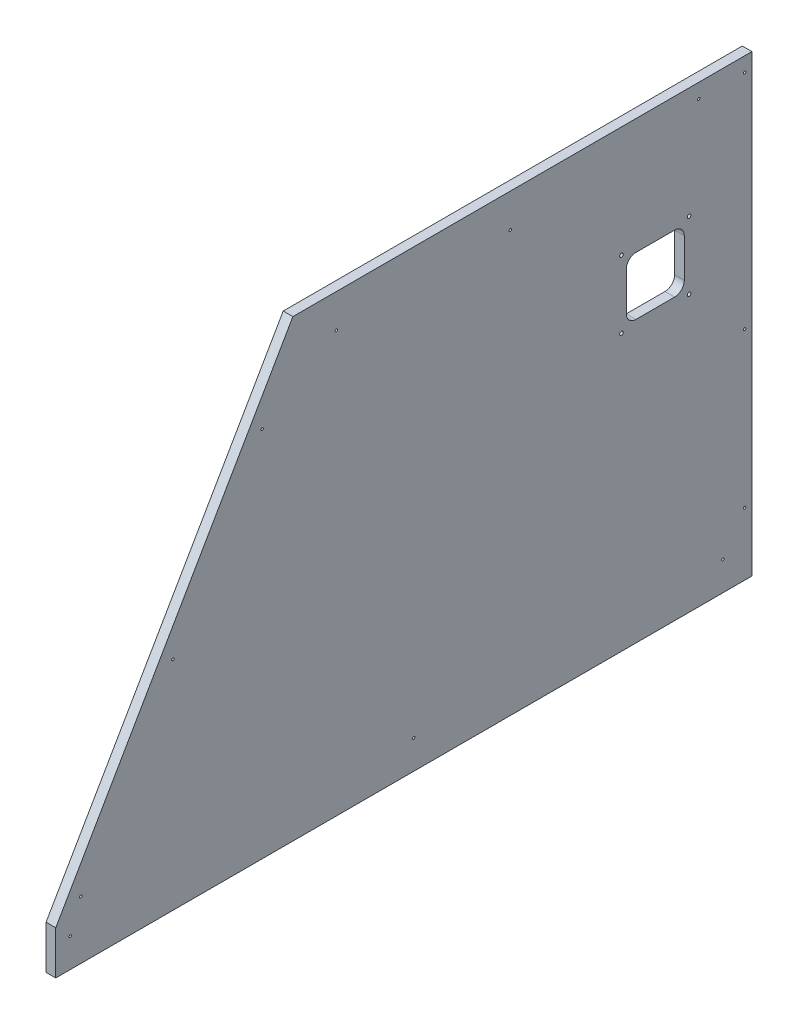
ISO-10303-21;
HEADER;
FILE_DESCRIPTION(('STEP AP214'),'2;1');
FILE_NAME('part.step','',(''),(''),'','','');
FILE_SCHEMA(('AUTOMOTIVE_DESIGN { 1 0 10303 214 1 1 1 1 }'));
ENDSEC;
DATA;
#1=APPLICATION_CONTEXT('core data for automotive mechanical design processes');
#2=APPLICATION_PROTOCOL_DEFINITION('international standard','automotive_design',2000,#1);
#3=PRODUCT_CONTEXT('',#1,'mechanical');
#4=PRODUCT('Part','Part','',(#3));
#5=PRODUCT_RELATED_PRODUCT_CATEGORY('part','',(#4));
#6=PRODUCT_DEFINITION_FORMATION('','',#4);
#7=PRODUCT_DEFINITION_CONTEXT('part definition',#1,'design');
#8=PRODUCT_DEFINITION('design','',#6,#7);
#9=PRODUCT_DEFINITION_SHAPE('','',#8);
#10=(LENGTH_UNIT() NAMED_UNIT(*) SI_UNIT(.MILLI.,.METRE.));
#11=(NAMED_UNIT(*) PLANE_ANGLE_UNIT() SI_UNIT($,.RADIAN.));
#12=(NAMED_UNIT(*) SI_UNIT($,.STERADIAN.) SOLID_ANGLE_UNIT());
#13=UNCERTAINTY_MEASURE_WITH_UNIT(LENGTH_MEASURE(1.E-05),#10,'distance_accuracy_value','');
#14=(GEOMETRIC_REPRESENTATION_CONTEXT(3) GLOBAL_UNCERTAINTY_ASSIGNED_CONTEXT((#13)) GLOBAL_UNIT_ASSIGNED_CONTEXT((#10,
#11,#12)) REPRESENTATION_CONTEXT('',''));
#15=CARTESIAN_POINT('',(0.,0.,0.));
#16=DIRECTION('',(0.,0.,1.));
#17=DIRECTION('',(1.,0.,0.));
#18=AXIS2_PLACEMENT_3D('',#15,#16,#17);
#19=CARTESIAN_POINT('',(-622.3,0.,0.));
#20=DIRECTION('',(-1.,0.,0.));
#21=DIRECTION('',(0.,0.,1.));
#22=AXIS2_PLACEMENT_3D('',#19,#20,#21);
#23=PLANE('',#22);
#24=DIRECTION('',(0.,0.,-1.));
#25=VECTOR('',#24,1.);
#26=CARTESIAN_POINT('',(-622.3,368.3,-501.65));
#27=LINE('',#26,#25);
#28=CARTESIAN_POINT('',(-622.3,368.3,-450.85));
#29=VERTEX_POINT('',#28);
#30=CARTESIAN_POINT('',(-622.3,368.3,-501.65));
#31=VERTEX_POINT('',#30);
#32=EDGE_CURVE('E138',#29,#31,#27,.T.);
#33=ORIENTED_EDGE('',*,*,#32,.T.);
#34=CARTESIAN_POINT('',(-622.3,381.,-501.65));
#35=DIRECTION('',(-1.,0.,0.));
#36=DIRECTION('',(0.,0.,1.));
#37=AXIS2_PLACEMENT_3D('',#34,#35,#36);
#38=CIRCLE('',#37,12.7);
#39=CARTESIAN_POINT('',(-622.3,381.,-514.35));
#40=VERTEX_POINT('',#39);
#41=EDGE_CURVE('E82',#31,#40,#38,.F.);
#42=ORIENTED_EDGE('',*,*,#41,.T.);
#43=DIRECTION('',(0.,1.,0.));
#44=VECTOR('',#43,1.);
#45=CARTESIAN_POINT('',(-622.3,431.8,-514.35));
#46=LINE('',#45,#44);
#47=CARTESIAN_POINT('',(-622.3,431.8,-514.35));
#48=VERTEX_POINT('',#47);
#49=EDGE_CURVE('E150',#40,#48,#46,.T.);
#50=ORIENTED_EDGE('',*,*,#49,.T.);
#51=CARTESIAN_POINT('',(-622.3,431.8,-501.65));
#52=DIRECTION('',(-1.,0.,0.));
#53=DIRECTION('',(0.,0.,1.));
#54=AXIS2_PLACEMENT_3D('',#51,#52,#53);
#55=CIRCLE('',#54,12.7);
#56=CARTESIAN_POINT('',(-622.3,444.5,-501.65));
#57=VERTEX_POINT('',#56);
#58=EDGE_CURVE('E221',#48,#57,#55,.F.);
#59=ORIENTED_EDGE('',*,*,#58,.T.);
#60=DIRECTION('',(0.,0.,1.));
#61=VECTOR('',#60,1.);
#62=CARTESIAN_POINT('',(-622.3,444.5,-450.85));
#63=LINE('',#62,#61);
#64=CARTESIAN_POINT('',(-622.3,444.5,-450.85));
#65=VERTEX_POINT('',#64);
#66=EDGE_CURVE('E146',#57,#65,#63,.T.);
#67=ORIENTED_EDGE('',*,*,#66,.T.);
#68=CARTESIAN_POINT('',(-622.3,431.8,-450.85));
#69=DIRECTION('',(-1.,0.,0.));
#70=DIRECTION('',(0.,0.,1.));
#71=AXIS2_PLACEMENT_3D('',#68,#69,#70);
#72=CIRCLE('',#71,12.7);
#73=CARTESIAN_POINT('',(-622.3,431.8,-438.15));
#74=VERTEX_POINT('',#73);
#75=EDGE_CURVE('E219',#65,#74,#72,.F.);
#76=ORIENTED_EDGE('',*,*,#75,.T.);
#77=DIRECTION('',(0.,1.,0.));
#78=VECTOR('',#77,1.);
#79=CARTESIAN_POINT('',(-622.3,381.,-438.15));
#80=LINE('',#79,#78);
#81=CARTESIAN_POINT('',(-622.3,381.,-438.15));
#82=VERTEX_POINT('',#81);
#83=EDGE_CURVE('E142',#74,#82,#80,.F.);
#84=ORIENTED_EDGE('',*,*,#83,.T.);
#85=CARTESIAN_POINT('',(-622.3,381.,-450.85));
#86=DIRECTION('',(-1.,0.,0.));
#87=DIRECTION('',(0.,0.,1.));
#88=AXIS2_PLACEMENT_3D('',#85,#86,#87);
#89=CIRCLE('',#88,12.7);
#90=EDGE_CURVE('E217',#82,#29,#89,.F.);
#91=ORIENTED_EDGE('',*,*,#90,.T.);
#92=EDGE_LOOP('',(#33,#42,#50,#59,#67,#76,#84,#91));
#93=FACE_BOUND('',#92,.T.);
#94=CARTESIAN_POINT('',(-622.3,450.85,-431.8));
#95=DIRECTION('',(-1.,0.,0.));
#96=DIRECTION('',(0.,0.,1.));
#97=AXIS2_PLACEMENT_3D('',#94,#95,#96);
#98=CIRCLE('',#97,2.38125);
#99=CARTESIAN_POINT('',(-622.3,450.85,-429.41875));
#100=VERTEX_POINT('',#99);
#101=EDGE_CURVE('E224',#100,#100,#98,.F.);
#102=ORIENTED_EDGE('',*,*,#101,.T.);
#103=EDGE_LOOP('',(#102));
#104=FACE_BOUND('',#103,.T.);
#105=CARTESIAN_POINT('',(-622.3,361.95,-431.8));
#106=DIRECTION('',(-1.,0.,0.));
#107=DIRECTION('',(0.,0.,1.));
#108=AXIS2_PLACEMENT_3D('',#105,#106,#107);
#109=CIRCLE('',#108,2.38125);
#110=CARTESIAN_POINT('',(-622.3,361.95,-429.41875));
#111=VERTEX_POINT('',#110);
#112=EDGE_CURVE('E227',#111,#111,#109,.F.);
#113=ORIENTED_EDGE('',*,*,#112,.T.);
#114=EDGE_LOOP('',(#113));
#115=FACE_BOUND('',#114,.T.);
#116=CARTESIAN_POINT('',(-622.3,361.95,-520.7));
#117=DIRECTION('',(-1.,0.,0.));
#118=DIRECTION('',(0.,0.,1.));
#119=AXIS2_PLACEMENT_3D('',#116,#117,#118);
#120=CIRCLE('',#119,2.38125);
#121=CARTESIAN_POINT('',(-622.3,361.95,-518.31875));
#122=VERTEX_POINT('',#121);
#123=EDGE_CURVE('E230',#122,#122,#120,.F.);
#124=ORIENTED_EDGE('',*,*,#123,.T.);
#125=EDGE_LOOP('',(#124));
#126=FACE_BOUND('',#125,.T.);
#127=CARTESIAN_POINT('',(-622.3,450.85,-520.7));
#128=DIRECTION('',(-1.,0.,0.));
#129=DIRECTION('',(0.,0.,1.));
#130=AXIS2_PLACEMENT_3D('',#127,#128,#129);
#131=CIRCLE('',#130,2.38125);
#132=CARTESIAN_POINT('',(-622.3,450.85,-518.31875));
#133=VERTEX_POINT('',#132);
#134=EDGE_CURVE('E233',#133,#133,#131,.F.);
#135=ORIENTED_EDGE('',*,*,#134,.T.);
#136=EDGE_LOOP('',(#135));
#137=FACE_BOUND('',#136,.T.);
#138=CARTESIAN_POINT('',(-622.3,82.55,-593.725));
#139=DIRECTION('',(-1.,0.,0.));
#140=DIRECTION('',(0.,0.,1.));
#141=AXIS2_PLACEMENT_3D('',#138,#139,#140);
#142=CIRCLE('',#141,1.5875);
#143=CARTESIAN_POINT('',(-622.3,82.55,-592.1375));
#144=VERTEX_POINT('',#143);
#145=EDGE_CURVE('E236',#144,#144,#142,.F.);
#146=ORIENTED_EDGE('',*,*,#145,.T.);
#147=EDGE_LOOP('',(#146));
#148=FACE_BOUND('',#147,.T.);
#149=CARTESIAN_POINT('',(-622.3,488.95,40.3279163028834));
#150=DIRECTION('',(-1.,0.,0.));
#151=DIRECTION('',(0.,0.,1.));
#152=AXIS2_PLACEMENT_3D('',#149,#150,#151);
#153=CIRCLE('',#152,1.5875);
#154=CARTESIAN_POINT('',(-622.3,488.95,41.9154163028834));
#155=VERTEX_POINT('',#154);
#156=EDGE_CURVE('E239',#155,#155,#153,.F.);
#157=ORIENTED_EDGE('',*,*,#156,.T.);
#158=EDGE_LOOP('',(#157));
#159=FACE_BOUND('',#158,.T.);
#160=CARTESIAN_POINT('',(-622.3,552.45,-285.75));
#161=DIRECTION('',(-1.,0.,0.));
#162=DIRECTION('',(0.,0.,1.));
#163=AXIS2_PLACEMENT_3D('',#160,#161,#162);
#164=CIRCLE('',#163,1.5875);
#165=CARTESIAN_POINT('',(-622.3,552.45,-284.1625));
#166=VERTEX_POINT('',#165);
#167=EDGE_CURVE('E242',#166,#166,#164,.F.);
#168=ORIENTED_EDGE('',*,*,#167,.T.);
#169=EDGE_LOOP('',(#168));
#170=FACE_BOUND('',#169,.T.);
#171=CARTESIAN_POINT('',(-622.3,38.1,-158.75));
#172=DIRECTION('',(-1.,0.,0.));
#173=DIRECTION('',(0.,0.,1.));
#174=AXIS2_PLACEMENT_3D('',#171,#172,#173);
#175=CIRCLE('',#174,1.5875);
#176=CARTESIAN_POINT('',(-622.3,38.1,-157.1625));
#177=VERTEX_POINT('',#176);
#178=EDGE_CURVE('E245',#177,#177,#175,.F.);
#179=ORIENTED_EDGE('',*,*,#178,.T.);
#180=EDGE_LOOP('',(#179));
#181=FACE_BOUND('',#180,.T.);
#182=CARTESIAN_POINT('',(-622.3,285.75,157.645491002215));
#183=DIRECTION('',(-1.,0.,0.));
#184=DIRECTION('',(0.,0.,1.));
#185=AXIS2_PLACEMENT_3D('',#182,#183,#184);
#186=CIRCLE('',#185,1.5875);
#187=CARTESIAN_POINT('',(-622.3,285.75,159.232991002215));
#188=VERTEX_POINT('',#187);
#189=EDGE_CURVE('E248',#188,#188,#186,.F.);
#190=ORIENTED_EDGE('',*,*,#189,.T.);
#191=EDGE_LOOP('',(#190));
#192=FACE_BOUND('',#191,.T.);
#193=CARTESIAN_POINT('',(-622.3,38.1,292.574807795112));
#194=DIRECTION('',(-1.,0.,0.));
#195=DIRECTION('',(0.,0.,1.));
#196=AXIS2_PLACEMENT_3D('',#193,#194,#195);
#197=CIRCLE('',#196,1.5875);
#198=CARTESIAN_POINT('',(-622.3,38.1,294.162307795112));
#199=VERTEX_POINT('',#198);
#200=EDGE_CURVE('E251',#199,#199,#197,.F.);
#201=ORIENTED_EDGE('',*,*,#200,.T.);
#202=EDGE_LOOP('',(#201));
#203=FACE_BOUND('',#202,.T.);
#204=CARTESIAN_POINT('',(-622.3,38.1,-565.15));
#205=DIRECTION('',(-1.,0.,0.));
#206=DIRECTION('',(0.,0.,1.));
#207=AXIS2_PLACEMENT_3D('',#204,#205,#206);
#208=CIRCLE('',#207,1.5875);
#209=CARTESIAN_POINT('',(-622.3,38.1,-563.5625));
#210=VERTEX_POINT('',#209);
#211=EDGE_CURVE('E254',#210,#210,#208,.F.);
#212=ORIENTED_EDGE('',*,*,#211,.T.);
#213=EDGE_LOOP('',(#212));
#214=FACE_BOUND('',#213,.T.);
#215=CARTESIAN_POINT('',(-622.3,285.75,-593.725));
#216=DIRECTION('',(-1.,0.,0.));
#217=DIRECTION('',(0.,0.,1.));
#218=AXIS2_PLACEMENT_3D('',#215,#216,#217);
#219=CIRCLE('',#218,1.5875);
#220=CARTESIAN_POINT('',(-622.3,285.75,-592.1375));
#221=VERTEX_POINT('',#220);
#222=EDGE_CURVE('E257',#221,#221,#219,.F.);
#223=ORIENTED_EDGE('',*,*,#222,.T.);
#224=EDGE_LOOP('',(#223));
#225=FACE_BOUND('',#224,.T.);
#226=CARTESIAN_POINT('',(-622.3,577.85,-593.725));
#227=DIRECTION('',(-1.,0.,0.));
#228=DIRECTION('',(0.,0.,1.));
#229=AXIS2_PLACEMENT_3D('',#226,#227,#228);
#230=CIRCLE('',#229,1.5875);
#231=CARTESIAN_POINT('',(-622.3,577.85,-592.1375));
#232=VERTEX_POINT('',#231);
#233=EDGE_CURVE('E260',#232,#232,#230,.F.);
#234=ORIENTED_EDGE('',*,*,#233,.T.);
#235=EDGE_LOOP('',(#234));
#236=FACE_BOUND('',#235,.T.);
#237=CARTESIAN_POINT('',(-622.3,76.2,278.62923991084));
#238=DIRECTION('',(-1.,0.,0.));
#239=DIRECTION('',(0.,0.,1.));
#240=AXIS2_PLACEMENT_3D('',#237,#238,#239);
#241=CIRCLE('',#240,1.5875);
#242=CARTESIAN_POINT('',(-622.3,76.2,280.21673991084));
#243=VERTEX_POINT('',#242);
#244=EDGE_CURVE('E263',#243,#243,#241,.F.);
#245=ORIENTED_EDGE('',*,*,#244,.T.);
#246=EDGE_LOOP('',(#245));
#247=FACE_BOUND('',#246,.T.);
#248=CARTESIAN_POINT('',(-622.3,552.45,-57.15));
#249=DIRECTION('',(-1.,0.,0.));
#250=DIRECTION('',(0.,0.,1.));
#251=AXIS2_PLACEMENT_3D('',#248,#249,#250);
#252=CIRCLE('',#251,1.5875);
#253=CARTESIAN_POINT('',(-622.3,552.45,-55.5625));
#254=VERTEX_POINT('',#253);
#255=EDGE_CURVE('E265',#254,#254,#252,.F.);
#256=ORIENTED_EDGE('',*,*,#255,.T.);
#257=EDGE_LOOP('',(#256));
#258=FACE_BOUND('',#257,.T.);
#259=CARTESIAN_POINT('',(-622.3,577.85,-533.4));
#260=DIRECTION('',(-1.,0.,0.));
#261=DIRECTION('',(0.,0.,1.));
#262=AXIS2_PLACEMENT_3D('',#259,#260,#261);
#263=CIRCLE('',#262,1.5875);
#264=CARTESIAN_POINT('',(-622.3,577.85,-531.8125));
#265=VERTEX_POINT('',#264);
#266=EDGE_CURVE('E19',#265,#265,#263,.F.);
#267=ORIENTED_EDGE('',*,*,#266,.T.);
#268=EDGE_LOOP('',(#267));
#269=FACE_BOUND('',#268,.T.);
#270=DIRECTION('',(0.,0.,1.));
#271=VECTOR('',#270,1.);
#272=CARTESIAN_POINT('',(-622.3,596.9,0.));
#273=LINE('',#272,#271);
#274=CARTESIAN_POINT('',(-622.3,596.9,-603.25));
#275=VERTEX_POINT('',#274);
#276=CARTESIAN_POINT('',(-622.3,596.9,-4.57966997657877E-13));
#277=VERTEX_POINT('',#276);
#278=EDGE_CURVE('E130',#275,#277,#273,.T.);
#279=ORIENTED_EDGE('',*,*,#278,.F.);
#280=DIRECTION('',(0.,1.,0.));
#281=VECTOR('',#280,1.);
#282=CARTESIAN_POINT('',(-622.3,596.9,-603.25));
#283=LINE('',#282,#281);
#284=CARTESIAN_POINT('',(-622.3,0.,-603.25));
#285=VERTEX_POINT('',#284);
#286=EDGE_CURVE('E128',#285,#275,#283,.T.);
#287=ORIENTED_EDGE('',*,*,#286,.F.);
#288=DIRECTION('',(0.,0.,-1.));
#289=VECTOR('',#288,1.);
#290=CARTESIAN_POINT('',(-622.3,0.,0.));
#291=LINE('',#290,#289);
#292=CARTESIAN_POINT('',(-622.3,0.,311.624807795112));
#293=VERTEX_POINT('',#292);
#294=EDGE_CURVE('E115',#293,#285,#291,.T.);
#295=ORIENTED_EDGE('',*,*,#294,.F.);
#296=DIRECTION('',(0.,1.,0.));
#297=VECTOR('',#296,1.);
#298=CARTESIAN_POINT('',(-622.3,0.,311.624807795112));
#299=LINE('',#298,#297);
#300=CARTESIAN_POINT('',(-622.3,57.15,311.624807795112));
#301=VERTEX_POINT('',#300);
#302=EDGE_CURVE('E125',#301,#293,#299,.F.);
#303=ORIENTED_EDGE('',*,*,#302,.F.);
#304=DIRECTION('',(0.,-0.866025403784429,0.500000000000017));
#305=VECTOR('',#304,1.);
#306=CARTESIAN_POINT('',(-622.3,57.15,311.624807795112));
#307=LINE('',#306,#305);
#308=EDGE_CURVE('E287',#277,#301,#307,.T.);
#309=ORIENTED_EDGE('',*,*,#308,.F.);
#310=EDGE_LOOP('',(#279,#287,#295,#303,#309));
#311=FACE_BOUND('',#310,.T.);
#312=ADVANCED_FACE('F16',(#93,#104,#115,#126,#137,#148,#159,#170,#181,#192,#203,#214,#225,#236,
#247,#258,#269,#311),#23,.T.);
#313=CARTESIAN_POINT('',(-609.6,596.9,-603.25));
#314=DIRECTION('',(0.,0.,-1.));
#315=DIRECTION('',(-1.,0.,0.));
#316=AXIS2_PLACEMENT_3D('',#313,#314,#315);
#317=PLANE('',#316);
#318=DIRECTION('',(1.,0.,0.));
#319=VECTOR('',#318,1.);
#320=CARTESIAN_POINT('',(-609.6,596.9,-603.25));
#321=LINE('',#320,#319);
#322=CARTESIAN_POINT('',(-609.6,596.9,-603.25));
#323=VERTEX_POINT('',#322);
#324=EDGE_CURVE('E278',#323,#275,#321,.F.);
#325=ORIENTED_EDGE('',*,*,#324,.F.);
#326=DIRECTION('',(0.,1.,0.));
#327=VECTOR('',#326,1.);
#328=CARTESIAN_POINT('',(-609.6,0.,-603.25));
#329=LINE('',#328,#327);
#330=CARTESIAN_POINT('',(-609.6,0.,-603.25));
#331=VERTEX_POINT('',#330);
#332=EDGE_CURVE('E91',#323,#331,#329,.F.);
#333=ORIENTED_EDGE('',*,*,#332,.T.);
#334=DIRECTION('',(1.,0.,0.));
#335=VECTOR('',#334,1.);
#336=CARTESIAN_POINT('',(-609.6,0.,-603.25));
#337=LINE('',#336,#335);
#338=EDGE_CURVE('E120',#285,#331,#337,.T.);
#339=ORIENTED_EDGE('',*,*,#338,.F.);
#340=ORIENTED_EDGE('',*,*,#286,.T.);
#341=EDGE_LOOP('',(#325,#333,#339,#340));
#342=FACE_BOUND('',#341,.T.);
#343=ADVANCED_FACE('F134',(#342),#317,.T.);
#344=CARTESIAN_POINT('',(-609.6,0.,0.));
#345=DIRECTION('',(0.,-1.,0.));
#346=DIRECTION('',(0.,0.,-1.));
#347=AXIS2_PLACEMENT_3D('',#344,#345,#346);
#348=PLANE('',#347);
#349=ORIENTED_EDGE('',*,*,#294,.T.);
#350=ORIENTED_EDGE('',*,*,#338,.T.);
#351=DIRECTION('',(0.,0.,1.));
#352=VECTOR('',#351,1.);
#353=CARTESIAN_POINT('',(-609.6,0.,0.));
#354=LINE('',#353,#352);
#355=CARTESIAN_POINT('',(-609.6,0.,311.624807795112));
#356=VERTEX_POINT('',#355);
#357=EDGE_CURVE('E304',#331,#356,#354,.T.);
#358=ORIENTED_EDGE('',*,*,#357,.T.);
#359=DIRECTION('',(1.,0.,0.));
#360=VECTOR('',#359,1.);
#361=CARTESIAN_POINT('',(-609.6,0.,311.624807795112));
#362=LINE('',#361,#360);
#363=EDGE_CURVE('E122',#293,#356,#362,.T.);
#364=ORIENTED_EDGE('',*,*,#363,.F.);
#365=EDGE_LOOP('',(#349,#350,#358,#364));
#366=FACE_BOUND('',#365,.T.);
#367=ADVANCED_FACE('F117',(#366),#348,.T.);
#368=CARTESIAN_POINT('',(-609.6,0.,311.624807795112));
#369=DIRECTION('',(0.,0.,1.));
#370=DIRECTION('',(1.,0.,0.));
#371=AXIS2_PLACEMENT_3D('',#368,#369,#370);
#372=PLANE('',#371);
#373=ORIENTED_EDGE('',*,*,#363,.T.);
#374=DIRECTION('',(0.,1.,0.));
#375=VECTOR('',#374,1.);
#376=CARTESIAN_POINT('',(-609.6,0.,311.624807795112));
#377=LINE('',#376,#375);
#378=CARTESIAN_POINT('',(-609.6,57.15,311.624807795112));
#379=VERTEX_POINT('',#378);
#380=EDGE_CURVE('E301',#356,#379,#377,.T.);
#381=ORIENTED_EDGE('',*,*,#380,.T.);
#382=DIRECTION('',(1.,0.,0.));
#383=VECTOR('',#382,1.);
#384=CARTESIAN_POINT('',(-609.6,57.15,311.624807795112));
#385=LINE('',#384,#383);
#386=EDGE_CURVE('E284',#301,#379,#385,.T.);
#387=ORIENTED_EDGE('',*,*,#386,.F.);
#388=ORIENTED_EDGE('',*,*,#302,.T.);
#389=EDGE_LOOP('',(#373,#381,#387,#388));
#390=FACE_BOUND('',#389,.T.);
#391=ADVANCED_FACE('F291',(#390),#372,.T.);
#392=CARTESIAN_POINT('',(-609.6,57.15,311.624807795112));
#393=DIRECTION('',(0.,0.500000000000017,0.866025403784429));
#394=DIRECTION('',(0.,-0.866025403784429,0.500000000000017));
#395=AXIS2_PLACEMENT_3D('',#392,#393,#394);
#396=PLANE('',#395);
#397=ORIENTED_EDGE('',*,*,#386,.T.);
#398=DIRECTION('',(0.,0.866025403784431,-0.500000000000014));
#399=VECTOR('',#398,1.);
#400=CARTESIAN_POINT('',(-609.6,57.15,311.624807795112));
#401=LINE('',#400,#399);
#402=CARTESIAN_POINT('',(-609.6,596.9,-9.15933995315754E-13));
#403=VERTEX_POINT('',#402);
#404=EDGE_CURVE('E298',#379,#403,#401,.T.);
#405=ORIENTED_EDGE('',*,*,#404,.T.);
#406=DIRECTION('',(1.,0.,0.));
#407=VECTOR('',#406,1.);
#408=CARTESIAN_POINT('',(-609.6,596.9,0.));
#409=LINE('',#408,#407);
#410=EDGE_CURVE('E270',#277,#403,#409,.T.);
#411=ORIENTED_EDGE('',*,*,#410,.F.);
#412=ORIENTED_EDGE('',*,*,#308,.T.);
#413=EDGE_LOOP('',(#397,#405,#411,#412));
#414=FACE_BOUND('',#413,.T.);
#415=ADVANCED_FACE('F296',(#414),#396,.T.);
#416=CARTESIAN_POINT('',(-609.6,596.9,0.));
#417=DIRECTION('',(0.,1.,0.));
#418=DIRECTION('',(0.,0.,1.));
#419=AXIS2_PLACEMENT_3D('',#416,#417,#418);
#420=PLANE('',#419);
#421=ORIENTED_EDGE('',*,*,#410,.T.);
#422=DIRECTION('',(0.,0.,1.));
#423=VECTOR('',#422,1.);
#424=CARTESIAN_POINT('',(-609.6,596.9,0.));
#425=LINE('',#424,#423);
#426=EDGE_CURVE('E216',#403,#323,#425,.F.);
#427=ORIENTED_EDGE('',*,*,#426,.T.);
#428=ORIENTED_EDGE('',*,*,#324,.T.);
#429=ORIENTED_EDGE('',*,*,#278,.T.);
#430=EDGE_LOOP('',(#421,#427,#428,#429));
#431=FACE_BOUND('',#430,.T.);
#432=ADVANCED_FACE('F588',(#431),#420,.T.);
#433=CARTESIAN_POINT('',(-622.3,577.85,-533.4));
#434=DIRECTION('',(-1.,0.,0.));
#435=DIRECTION('',(0.,0.,1.));
#436=AXIS2_PLACEMENT_3D('',#433,#434,#435);
#437=CYLINDRICAL_SURFACE('',#436,1.5875);
#438=ORIENTED_EDGE('',*,*,#266,.F.);
#439=EDGE_LOOP('',(#438));
#440=FACE_BOUND('',#439,.T.);
#441=CARTESIAN_POINT('',(-609.6,577.85,-533.4));
#442=DIRECTION('',(-1.,0.,0.));
#443=DIRECTION('',(0.,0.,1.));
#444=AXIS2_PLACEMENT_3D('',#441,#442,#443);
#445=CIRCLE('',#444,1.5875);
#446=CARTESIAN_POINT('',(-609.6,577.85,-531.8125));
#447=VERTEX_POINT('',#446);
#448=EDGE_CURVE('E213',#447,#447,#445,.F.);
#449=ORIENTED_EDGE('',*,*,#448,.T.);
#450=EDGE_LOOP('',(#449));
#451=FACE_BOUND('',#450,.T.);
#452=ADVANCED_FACE('F578',(#440,#451),#437,.F.);
#453=CARTESIAN_POINT('',(-622.3,552.45,-57.15));
#454=DIRECTION('',(-1.,0.,0.));
#455=DIRECTION('',(0.,0.,1.));
#456=AXIS2_PLACEMENT_3D('',#453,#454,#455);
#457=CYLINDRICAL_SURFACE('',#456,1.5875);
#458=ORIENTED_EDGE('',*,*,#255,.F.);
#459=EDGE_LOOP('',(#458));
#460=FACE_BOUND('',#459,.T.);
#461=CARTESIAN_POINT('',(-609.6,552.45,-57.15));
#462=DIRECTION('',(-1.,0.,0.));
#463=DIRECTION('',(0.,0.,1.));
#464=AXIS2_PLACEMENT_3D('',#461,#462,#463);
#465=CIRCLE('',#464,1.5875);
#466=CARTESIAN_POINT('',(-609.6,552.45,-55.5625));
#467=VERTEX_POINT('',#466);
#468=EDGE_CURVE('E210',#467,#467,#465,.F.);
#469=ORIENTED_EDGE('',*,*,#468,.T.);
#470=EDGE_LOOP('',(#469));
#471=FACE_BOUND('',#470,.T.);
#472=ADVANCED_FACE('F568',(#460,#471),#457,.F.);
#473=CARTESIAN_POINT('',(-622.3,76.2,278.62923991084));
#474=DIRECTION('',(-1.,0.,0.));
#475=DIRECTION('',(0.,0.,1.));
#476=AXIS2_PLACEMENT_3D('',#473,#474,#475);
#477=CYLINDRICAL_SURFACE('',#476,1.5875);
#478=ORIENTED_EDGE('',*,*,#244,.F.);
#479=EDGE_LOOP('',(#478));
#480=FACE_BOUND('',#479,.T.);
#481=CARTESIAN_POINT('',(-609.6,76.2,278.62923991084));
#482=DIRECTION('',(-1.,0.,0.));
#483=DIRECTION('',(0.,0.,1.));
#484=AXIS2_PLACEMENT_3D('',#481,#482,#483);
#485=CIRCLE('',#484,1.5875);
#486=CARTESIAN_POINT('',(-609.6,76.2,280.21673991084));
#487=VERTEX_POINT('',#486);
#488=EDGE_CURVE('E207',#487,#487,#485,.F.);
#489=ORIENTED_EDGE('',*,*,#488,.T.);
#490=EDGE_LOOP('',(#489));
#491=FACE_BOUND('',#490,.T.);
#492=ADVANCED_FACE('F558',(#480,#491),#477,.F.);
#493=CARTESIAN_POINT('',(-622.3,577.85,-593.725));
#494=DIRECTION('',(-1.,0.,0.));
#495=DIRECTION('',(0.,0.,1.));
#496=AXIS2_PLACEMENT_3D('',#493,#494,#495);
#497=CYLINDRICAL_SURFACE('',#496,1.5875);
#498=ORIENTED_EDGE('',*,*,#233,.F.);
#499=EDGE_LOOP('',(#498));
#500=FACE_BOUND('',#499,.T.);
#501=CARTESIAN_POINT('',(-609.6,577.85,-593.725));
#502=DIRECTION('',(-1.,0.,0.));
#503=DIRECTION('',(0.,0.,1.));
#504=AXIS2_PLACEMENT_3D('',#501,#502,#503);
#505=CIRCLE('',#504,1.5875);
#506=CARTESIAN_POINT('',(-609.6,577.85,-592.1375));
#507=VERTEX_POINT('',#506);
#508=EDGE_CURVE('E204',#507,#507,#505,.F.);
#509=ORIENTED_EDGE('',*,*,#508,.T.);
#510=EDGE_LOOP('',(#509));
#511=FACE_BOUND('',#510,.T.);
#512=ADVANCED_FACE('F548',(#500,#511),#497,.F.);
#513=CARTESIAN_POINT('',(-622.3,285.75,-593.725));
#514=DIRECTION('',(-1.,0.,0.));
#515=DIRECTION('',(0.,0.,1.));
#516=AXIS2_PLACEMENT_3D('',#513,#514,#515);
#517=CYLINDRICAL_SURFACE('',#516,1.5875);
#518=ORIENTED_EDGE('',*,*,#222,.F.);
#519=EDGE_LOOP('',(#518));
#520=FACE_BOUND('',#519,.T.);
#521=CARTESIAN_POINT('',(-609.6,285.75,-593.725));
#522=DIRECTION('',(-1.,0.,0.));
#523=DIRECTION('',(0.,0.,1.));
#524=AXIS2_PLACEMENT_3D('',#521,#522,#523);
#525=CIRCLE('',#524,1.5875);
#526=CARTESIAN_POINT('',(-609.6,285.75,-592.1375));
#527=VERTEX_POINT('',#526);
#528=EDGE_CURVE('E201',#527,#527,#525,.F.);
#529=ORIENTED_EDGE('',*,*,#528,.T.);
#530=EDGE_LOOP('',(#529));
#531=FACE_BOUND('',#530,.T.);
#532=ADVANCED_FACE('F538',(#520,#531),#517,.F.);
#533=CARTESIAN_POINT('',(-622.3,38.1,-565.15));
#534=DIRECTION('',(-1.,0.,0.));
#535=DIRECTION('',(0.,0.,1.));
#536=AXIS2_PLACEMENT_3D('',#533,#534,#535);
#537=CYLINDRICAL_SURFACE('',#536,1.5875);
#538=ORIENTED_EDGE('',*,*,#211,.F.);
#539=EDGE_LOOP('',(#538));
#540=FACE_BOUND('',#539,.T.);
#541=CARTESIAN_POINT('',(-609.6,38.1,-565.15));
#542=DIRECTION('',(-1.,0.,0.));
#543=DIRECTION('',(0.,0.,1.));
#544=AXIS2_PLACEMENT_3D('',#541,#542,#543);
#545=CIRCLE('',#544,1.5875);
#546=CARTESIAN_POINT('',(-609.6,38.1,-563.5625));
#547=VERTEX_POINT('',#546);
#548=EDGE_CURVE('E198',#547,#547,#545,.F.);
#549=ORIENTED_EDGE('',*,*,#548,.T.);
#550=EDGE_LOOP('',(#549));
#551=FACE_BOUND('',#550,.T.);
#552=ADVANCED_FACE('F528',(#540,#551),#537,.F.);
#553=CARTESIAN_POINT('',(-622.3,38.1,292.574807795112));
#554=DIRECTION('',(-1.,0.,0.));
#555=DIRECTION('',(0.,0.,1.));
#556=AXIS2_PLACEMENT_3D('',#553,#554,#555);
#557=CYLINDRICAL_SURFACE('',#556,1.5875);
#558=ORIENTED_EDGE('',*,*,#200,.F.);
#559=EDGE_LOOP('',(#558));
#560=FACE_BOUND('',#559,.T.);
#561=CARTESIAN_POINT('',(-609.6,38.1,292.574807795112));
#562=DIRECTION('',(-1.,0.,0.));
#563=DIRECTION('',(0.,0.,1.));
#564=AXIS2_PLACEMENT_3D('',#561,#562,#563);
#565=CIRCLE('',#564,1.5875);
#566=CARTESIAN_POINT('',(-609.6,38.1,294.162307795112));
#567=VERTEX_POINT('',#566);
#568=EDGE_CURVE('E195',#567,#567,#565,.F.);
#569=ORIENTED_EDGE('',*,*,#568,.T.);
#570=EDGE_LOOP('',(#569));
#571=FACE_BOUND('',#570,.T.);
#572=ADVANCED_FACE('F518',(#560,#571),#557,.F.);
#573=CARTESIAN_POINT('',(-622.3,285.75,157.645491002215));
#574=DIRECTION('',(-1.,0.,0.));
#575=DIRECTION('',(0.,0.,1.));
#576=AXIS2_PLACEMENT_3D('',#573,#574,#575);
#577=CYLINDRICAL_SURFACE('',#576,1.5875);
#578=ORIENTED_EDGE('',*,*,#189,.F.);
#579=EDGE_LOOP('',(#578));
#580=FACE_BOUND('',#579,.T.);
#581=CARTESIAN_POINT('',(-609.6,285.75,157.645491002215));
#582=DIRECTION('',(-1.,0.,0.));
#583=DIRECTION('',(0.,0.,1.));
#584=AXIS2_PLACEMENT_3D('',#581,#582,#583);
#585=CIRCLE('',#584,1.5875);
#586=CARTESIAN_POINT('',(-609.6,285.75,159.232991002215));
#587=VERTEX_POINT('',#586);
#588=EDGE_CURVE('E192',#587,#587,#585,.F.);
#589=ORIENTED_EDGE('',*,*,#588,.T.);
#590=EDGE_LOOP('',(#589));
#591=FACE_BOUND('',#590,.T.);
#592=ADVANCED_FACE('F508',(#580,#591),#577,.F.);
#593=CARTESIAN_POINT('',(-622.3,38.1,-158.75));
#594=DIRECTION('',(-1.,0.,0.));
#595=DIRECTION('',(0.,0.,1.));
#596=AXIS2_PLACEMENT_3D('',#593,#594,#595);
#597=CYLINDRICAL_SURFACE('',#596,1.5875);
#598=ORIENTED_EDGE('',*,*,#178,.F.);
#599=EDGE_LOOP('',(#598));
#600=FACE_BOUND('',#599,.T.);
#601=CARTESIAN_POINT('',(-609.6,38.1,-158.75));
#602=DIRECTION('',(-1.,0.,0.));
#603=DIRECTION('',(0.,0.,1.));
#604=AXIS2_PLACEMENT_3D('',#601,#602,#603);
#605=CIRCLE('',#604,1.5875);
#606=CARTESIAN_POINT('',(-609.6,38.1,-157.1625));
#607=VERTEX_POINT('',#606);
#608=EDGE_CURVE('E189',#607,#607,#605,.F.);
#609=ORIENTED_EDGE('',*,*,#608,.T.);
#610=EDGE_LOOP('',(#609));
#611=FACE_BOUND('',#610,.T.);
#612=ADVANCED_FACE('F498',(#600,#611),#597,.F.);
#613=CARTESIAN_POINT('',(-622.3,552.45,-285.75));
#614=DIRECTION('',(-1.,0.,0.));
#615=DIRECTION('',(0.,0.,1.));
#616=AXIS2_PLACEMENT_3D('',#613,#614,#615);
#617=CYLINDRICAL_SURFACE('',#616,1.5875);
#618=ORIENTED_EDGE('',*,*,#167,.F.);
#619=EDGE_LOOP('',(#618));
#620=FACE_BOUND('',#619,.T.);
#621=CARTESIAN_POINT('',(-609.6,552.45,-285.75));
#622=DIRECTION('',(-1.,0.,0.));
#623=DIRECTION('',(0.,0.,1.));
#624=AXIS2_PLACEMENT_3D('',#621,#622,#623);
#625=CIRCLE('',#624,1.5875);
#626=CARTESIAN_POINT('',(-609.6,552.45,-284.1625));
#627=VERTEX_POINT('',#626);
#628=EDGE_CURVE('E186',#627,#627,#625,.F.);
#629=ORIENTED_EDGE('',*,*,#628,.T.);
#630=EDGE_LOOP('',(#629));
#631=FACE_BOUND('',#630,.T.);
#632=ADVANCED_FACE('F488',(#620,#631),#617,.F.);
#633=CARTESIAN_POINT('',(-622.3,488.95,40.3279163028834));
#634=DIRECTION('',(-1.,0.,0.));
#635=DIRECTION('',(0.,0.,1.));
#636=AXIS2_PLACEMENT_3D('',#633,#634,#635);
#637=CYLINDRICAL_SURFACE('',#636,1.5875);
#638=ORIENTED_EDGE('',*,*,#156,.F.);
#639=EDGE_LOOP('',(#638));
#640=FACE_BOUND('',#639,.T.);
#641=CARTESIAN_POINT('',(-609.6,488.95,40.3279163028834));
#642=DIRECTION('',(-1.,0.,0.));
#643=DIRECTION('',(0.,0.,1.));
#644=AXIS2_PLACEMENT_3D('',#641,#642,#643);
#645=CIRCLE('',#644,1.5875);
#646=CARTESIAN_POINT('',(-609.6,488.95,41.9154163028834));
#647=VERTEX_POINT('',#646);
#648=EDGE_CURVE('E183',#647,#647,#645,.F.);
#649=ORIENTED_EDGE('',*,*,#648,.T.);
#650=EDGE_LOOP('',(#649));
#651=FACE_BOUND('',#650,.T.);
#652=ADVANCED_FACE('F478',(#640,#651),#637,.F.);
#653=CARTESIAN_POINT('',(-622.3,82.55,-593.725));
#654=DIRECTION('',(-1.,0.,0.));
#655=DIRECTION('',(0.,0.,1.));
#656=AXIS2_PLACEMENT_3D('',#653,#654,#655);
#657=CYLINDRICAL_SURFACE('',#656,1.5875);
#658=ORIENTED_EDGE('',*,*,#145,.F.);
#659=EDGE_LOOP('',(#658));
#660=FACE_BOUND('',#659,.T.);
#661=CARTESIAN_POINT('',(-609.6,82.55,-593.725));
#662=DIRECTION('',(-1.,0.,0.));
#663=DIRECTION('',(0.,0.,1.));
#664=AXIS2_PLACEMENT_3D('',#661,#662,#663);
#665=CIRCLE('',#664,1.5875);
#666=CARTESIAN_POINT('',(-609.6,82.55,-592.1375));
#667=VERTEX_POINT('',#666);
#668=EDGE_CURVE('E180',#667,#667,#665,.F.);
#669=ORIENTED_EDGE('',*,*,#668,.T.);
#670=EDGE_LOOP('',(#669));
#671=FACE_BOUND('',#670,.T.);
#672=ADVANCED_FACE('F468',(#660,#671),#657,.F.);
#673=CARTESIAN_POINT('',(-622.3,450.85,-520.7));
#674=DIRECTION('',(-1.,0.,0.));
#675=DIRECTION('',(0.,0.,1.));
#676=AXIS2_PLACEMENT_3D('',#673,#674,#675);
#677=CYLINDRICAL_SURFACE('',#676,2.38125);
#678=ORIENTED_EDGE('',*,*,#134,.F.);
#679=EDGE_LOOP('',(#678));
#680=FACE_BOUND('',#679,.T.);
#681=CARTESIAN_POINT('',(-609.6,450.85,-520.7));
#682=DIRECTION('',(-1.,0.,0.));
#683=DIRECTION('',(0.,0.,1.));
#684=AXIS2_PLACEMENT_3D('',#681,#682,#683);
#685=CIRCLE('',#684,2.38125);
#686=CARTESIAN_POINT('',(-609.6,450.85,-518.31875));
#687=VERTEX_POINT('',#686);
#688=EDGE_CURVE('E177',#687,#687,#685,.F.);
#689=ORIENTED_EDGE('',*,*,#688,.T.);
#690=EDGE_LOOP('',(#689));
#691=FACE_BOUND('',#690,.T.);
#692=ADVANCED_FACE('F458',(#680,#691),#677,.F.);
#693=CARTESIAN_POINT('',(-622.3,361.95,-520.7));
#694=DIRECTION('',(-1.,0.,0.));
#695=DIRECTION('',(0.,0.,1.));
#696=AXIS2_PLACEMENT_3D('',#693,#694,#695);
#697=CYLINDRICAL_SURFACE('',#696,2.38125);
#698=ORIENTED_EDGE('',*,*,#123,.F.);
#699=EDGE_LOOP('',(#698));
#700=FACE_BOUND('',#699,.T.);
#701=CARTESIAN_POINT('',(-609.6,361.95,-520.7));
#702=DIRECTION('',(-1.,0.,0.));
#703=DIRECTION('',(0.,0.,1.));
#704=AXIS2_PLACEMENT_3D('',#701,#702,#703);
#705=CIRCLE('',#704,2.38125);
#706=CARTESIAN_POINT('',(-609.6,361.95,-518.31875));
#707=VERTEX_POINT('',#706);
#708=EDGE_CURVE('E174',#707,#707,#705,.F.);
#709=ORIENTED_EDGE('',*,*,#708,.T.);
#710=EDGE_LOOP('',(#709));
#711=FACE_BOUND('',#710,.T.);
#712=ADVANCED_FACE('F448',(#700,#711),#697,.F.);
#713=CARTESIAN_POINT('',(-622.3,361.95,-431.8));
#714=DIRECTION('',(-1.,0.,0.));
#715=DIRECTION('',(0.,0.,1.));
#716=AXIS2_PLACEMENT_3D('',#713,#714,#715);
#717=CYLINDRICAL_SURFACE('',#716,2.38125);
#718=ORIENTED_EDGE('',*,*,#112,.F.);
#719=EDGE_LOOP('',(#718));
#720=FACE_BOUND('',#719,.T.);
#721=CARTESIAN_POINT('',(-609.6,361.95,-431.8));
#722=DIRECTION('',(-1.,0.,0.));
#723=DIRECTION('',(0.,0.,1.));
#724=AXIS2_PLACEMENT_3D('',#721,#722,#723);
#725=CIRCLE('',#724,2.38125);
#726=CARTESIAN_POINT('',(-609.6,361.95,-429.41875));
#727=VERTEX_POINT('',#726);
#728=EDGE_CURVE('E171',#727,#727,#725,.F.);
#729=ORIENTED_EDGE('',*,*,#728,.T.);
#730=EDGE_LOOP('',(#729));
#731=FACE_BOUND('',#730,.T.);
#732=ADVANCED_FACE('F438',(#720,#731),#717,.F.);
#733=CARTESIAN_POINT('',(-622.3,450.85,-431.8));
#734=DIRECTION('',(-1.,0.,0.));
#735=DIRECTION('',(0.,0.,1.));
#736=AXIS2_PLACEMENT_3D('',#733,#734,#735);
#737=CYLINDRICAL_SURFACE('',#736,2.38125);
#738=ORIENTED_EDGE('',*,*,#101,.F.);
#739=EDGE_LOOP('',(#738));
#740=FACE_BOUND('',#739,.T.);
#741=CARTESIAN_POINT('',(-609.6,450.85,-431.8));
#742=DIRECTION('',(-1.,0.,0.));
#743=DIRECTION('',(0.,0.,1.));
#744=AXIS2_PLACEMENT_3D('',#741,#742,#743);
#745=CIRCLE('',#744,2.38125);
#746=CARTESIAN_POINT('',(-609.6,450.85,-429.41875));
#747=VERTEX_POINT('',#746);
#748=EDGE_CURVE('E168',#747,#747,#745,.F.);
#749=ORIENTED_EDGE('',*,*,#748,.T.);
#750=EDGE_LOOP('',(#749));
#751=FACE_BOUND('',#750,.T.);
#752=ADVANCED_FACE('F429',(#740,#751),#737,.F.);
#753=CARTESIAN_POINT('',(-622.3,381.,-501.65));
#754=DIRECTION('',(-1.,0.,0.));
#755=DIRECTION('',(0.,0.,1.));
#756=AXIS2_PLACEMENT_3D('',#753,#754,#755);
#757=CYLINDRICAL_SURFACE('',#756,12.7);
#758=ORIENTED_EDGE('',*,*,#41,.F.);
#759=DIRECTION('',(1.,0.,0.));
#760=VECTOR('',#759,1.);
#761=CARTESIAN_POINT('',(-622.3,368.3,-501.65));
#762=LINE('',#761,#760);
#763=CARTESIAN_POINT('',(-609.6,368.3,-501.65));
#764=VERTEX_POINT('',#763);
#765=EDGE_CURVE('E141',#31,#764,#762,.T.);
#766=ORIENTED_EDGE('',*,*,#765,.T.);
#767=CARTESIAN_POINT('',(-609.6,381.,-501.65));
#768=DIRECTION('',(-1.,0.,0.));
#769=DIRECTION('',(0.,0.,1.));
#770=AXIS2_PLACEMENT_3D('',#767,#768,#769);
#771=CIRCLE('',#770,12.7);
#772=CARTESIAN_POINT('',(-609.6,381.,-514.35));
#773=VERTEX_POINT('',#772);
#774=EDGE_CURVE('E165',#764,#773,#771,.F.);
#775=ORIENTED_EDGE('',*,*,#774,.T.);
#776=DIRECTION('',(-1.,0.,0.));
#777=VECTOR('',#776,1.);
#778=CARTESIAN_POINT('',(-622.3,381.,-514.35));
#779=LINE('',#778,#777);
#780=EDGE_CURVE('E153',#773,#40,#779,.T.);
#781=ORIENTED_EDGE('',*,*,#780,.T.);
#782=EDGE_LOOP('',(#758,#766,#775,#781));
#783=FACE_BOUND('',#782,.T.);
#784=ADVANCED_FACE('F420',(#783),#757,.F.);
#785=CARTESIAN_POINT('',(-622.3,431.8,-514.35));
#786=DIRECTION('',(0.,0.,-1.));
#787=DIRECTION('',(-1.,0.,0.));
#788=AXIS2_PLACEMENT_3D('',#785,#786,#787);
#789=PLANE('',#788);
#790=ORIENTED_EDGE('',*,*,#49,.F.);
#791=ORIENTED_EDGE('',*,*,#780,.F.);
#792=DIRECTION('',(0.,1.,0.));
#793=VECTOR('',#792,1.);
#794=CARTESIAN_POINT('',(-609.6,0.,-514.35));
#795=LINE('',#794,#793);
#796=CARTESIAN_POINT('',(-609.6,431.8,-514.35));
#797=VERTEX_POINT('',#796);
#798=EDGE_CURVE('E164',#773,#797,#795,.T.);
#799=ORIENTED_EDGE('',*,*,#798,.T.);
#800=DIRECTION('',(-1.,0.,0.));
#801=VECTOR('',#800,1.);
#802=CARTESIAN_POINT('',(-622.3,431.8,-514.35));
#803=LINE('',#802,#801);
#804=EDGE_CURVE('E152',#797,#48,#803,.T.);
#805=ORIENTED_EDGE('',*,*,#804,.T.);
#806=EDGE_LOOP('',(#790,#791,#799,#805));
#807=FACE_BOUND('',#806,.T.);
#808=ADVANCED_FACE('F323',(#807),#789,.F.);
#809=CARTESIAN_POINT('',(-622.3,431.8,-501.65));
#810=DIRECTION('',(-1.,0.,0.));
#811=DIRECTION('',(0.,0.,1.));
#812=AXIS2_PLACEMENT_3D('',#809,#810,#811);
#813=CYLINDRICAL_SURFACE('',#812,12.7);
#814=ORIENTED_EDGE('',*,*,#58,.F.);
#815=ORIENTED_EDGE('',*,*,#804,.F.);
#816=CARTESIAN_POINT('',(-609.6,431.8,-501.65));
#817=DIRECTION('',(-1.,0.,0.));
#818=DIRECTION('',(0.,0.,1.));
#819=AXIS2_PLACEMENT_3D('',#816,#817,#818);
#820=CIRCLE('',#819,12.7);
#821=CARTESIAN_POINT('',(-609.6,444.5,-501.65));
#822=VERTEX_POINT('',#821);
#823=EDGE_CURVE('E161',#797,#822,#820,.F.);
#824=ORIENTED_EDGE('',*,*,#823,.T.);
#825=DIRECTION('',(1.,0.,0.));
#826=VECTOR('',#825,1.);
#827=CARTESIAN_POINT('',(-622.3,444.5,-501.65));
#828=LINE('',#827,#826);
#829=EDGE_CURVE('E149',#822,#57,#828,.F.);
#830=ORIENTED_EDGE('',*,*,#829,.T.);
#831=EDGE_LOOP('',(#814,#815,#824,#830));
#832=FACE_BOUND('',#831,.T.);
#833=ADVANCED_FACE('F328',(#832),#813,.F.);
#834=CARTESIAN_POINT('',(-622.3,444.5,-450.85));
#835=DIRECTION('',(0.,1.,0.));
#836=DIRECTION('',(0.,0.,1.));
#837=AXIS2_PLACEMENT_3D('',#834,#835,#836);
#838=PLANE('',#837);
#839=ORIENTED_EDGE('',*,*,#66,.F.);
#840=ORIENTED_EDGE('',*,*,#829,.F.);
#841=DIRECTION('',(0.,0.,1.));
#842=VECTOR('',#841,1.);
#843=CARTESIAN_POINT('',(-609.6,444.5,0.));
#844=LINE('',#843,#842);
#845=CARTESIAN_POINT('',(-609.6,444.5,-450.85));
#846=VERTEX_POINT('',#845);
#847=EDGE_CURVE('E160',#822,#846,#844,.T.);
#848=ORIENTED_EDGE('',*,*,#847,.T.);
#849=DIRECTION('',(-1.,0.,0.));
#850=VECTOR('',#849,1.);
#851=CARTESIAN_POINT('',(-622.3,444.5,-450.85));
#852=LINE('',#851,#850);
#853=EDGE_CURVE('E148',#846,#65,#852,.T.);
#854=ORIENTED_EDGE('',*,*,#853,.T.);
#855=EDGE_LOOP('',(#839,#840,#848,#854));
#856=FACE_BOUND('',#855,.T.);
#857=ADVANCED_FACE('F348',(#856),#838,.F.);
#858=CARTESIAN_POINT('',(-622.3,431.8,-450.85));
#859=DIRECTION('',(-1.,0.,0.));
#860=DIRECTION('',(0.,0.,1.));
#861=AXIS2_PLACEMENT_3D('',#858,#859,#860);
#862=CYLINDRICAL_SURFACE('',#861,12.7);
#863=ORIENTED_EDGE('',*,*,#75,.F.);
#864=ORIENTED_EDGE('',*,*,#853,.F.);
#865=CARTESIAN_POINT('',(-609.6,431.8,-450.85));
#866=DIRECTION('',(-1.,0.,0.));
#867=DIRECTION('',(0.,0.,1.));
#868=AXIS2_PLACEMENT_3D('',#865,#866,#867);
#869=CIRCLE('',#868,12.7);
#870=CARTESIAN_POINT('',(-609.6,431.8,-438.15));
#871=VERTEX_POINT('',#870);
#872=EDGE_CURVE('E157',#846,#871,#869,.F.);
#873=ORIENTED_EDGE('',*,*,#872,.T.);
#874=DIRECTION('',(1.,0.,0.));
#875=VECTOR('',#874,1.);
#876=CARTESIAN_POINT('',(-622.3,431.8,-438.15));
#877=LINE('',#876,#875);
#878=EDGE_CURVE('E145',#871,#74,#877,.F.);
#879=ORIENTED_EDGE('',*,*,#878,.T.);
#880=EDGE_LOOP('',(#863,#864,#873,#879));
#881=FACE_BOUND('',#880,.T.);
#882=ADVANCED_FACE('F346',(#881),#862,.F.);
#883=CARTESIAN_POINT('',(-622.3,381.,-438.15));
#884=DIRECTION('',(0.,0.,1.));
#885=DIRECTION('',(1.,0.,0.));
#886=AXIS2_PLACEMENT_3D('',#883,#884,#885);
#887=PLANE('',#886);
#888=ORIENTED_EDGE('',*,*,#83,.F.);
#889=ORIENTED_EDGE('',*,*,#878,.F.);
#890=DIRECTION('',(0.,1.,0.));
#891=VECTOR('',#890,1.);
#892=CARTESIAN_POINT('',(-609.6,0.,-438.15));
#893=LINE('',#892,#891);
#894=CARTESIAN_POINT('',(-609.6,381.,-438.15));
#895=VERTEX_POINT('',#894);
#896=EDGE_CURVE('E156',#871,#895,#893,.F.);
#897=ORIENTED_EDGE('',*,*,#896,.T.);
#898=DIRECTION('',(-1.,0.,0.));
#899=VECTOR('',#898,1.);
#900=CARTESIAN_POINT('',(-622.3,381.,-438.15));
#901=LINE('',#900,#899);
#902=EDGE_CURVE('E144',#895,#82,#901,.T.);
#903=ORIENTED_EDGE('',*,*,#902,.T.);
#904=EDGE_LOOP('',(#888,#889,#897,#903));
#905=FACE_BOUND('',#904,.T.);
#906=ADVANCED_FACE('F343',(#905),#887,.F.);
#907=CARTESIAN_POINT('',(-622.3,381.,-450.85));
#908=DIRECTION('',(-1.,0.,0.));
#909=DIRECTION('',(0.,0.,1.));
#910=AXIS2_PLACEMENT_3D('',#907,#908,#909);
#911=CYLINDRICAL_SURFACE('',#910,12.7);
#912=ORIENTED_EDGE('',*,*,#90,.F.);
#913=ORIENTED_EDGE('',*,*,#902,.F.);
#914=CARTESIAN_POINT('',(-609.6,381.,-450.85));
#915=DIRECTION('',(-1.,0.,0.));
#916=DIRECTION('',(0.,0.,1.));
#917=AXIS2_PLACEMENT_3D('',#914,#915,#916);
#918=CIRCLE('',#917,12.7);
#919=CARTESIAN_POINT('',(-609.6,368.3,-450.85));
#920=VERTEX_POINT('',#919);
#921=EDGE_CURVE('E25',#895,#920,#918,.F.);
#922=ORIENTED_EDGE('',*,*,#921,.T.);
#923=DIRECTION('',(1.,0.,0.));
#924=VECTOR('',#923,1.);
#925=CARTESIAN_POINT('',(-622.3,368.3,-450.85));
#926=LINE('',#925,#924);
#927=EDGE_CURVE('E33',#920,#29,#926,.F.);
#928=ORIENTED_EDGE('',*,*,#927,.T.);
#929=EDGE_LOOP('',(#912,#913,#922,#928));
#930=FACE_BOUND('',#929,.T.);
#931=ADVANCED_FACE('F354',(#930),#911,.F.);
#932=CARTESIAN_POINT('',(-622.3,368.3,-501.65));
#933=DIRECTION('',(0.,-1.,0.));
#934=DIRECTION('',(0.,0.,-1.));
#935=AXIS2_PLACEMENT_3D('',#932,#933,#934);
#936=PLANE('',#935);
#937=ORIENTED_EDGE('',*,*,#32,.F.);
#938=ORIENTED_EDGE('',*,*,#927,.F.);
#939=DIRECTION('',(0.,0.,1.));
#940=VECTOR('',#939,1.);
#941=CARTESIAN_POINT('',(-609.6,368.3,0.));
#942=LINE('',#941,#940);
#943=EDGE_CURVE('E11',#920,#764,#942,.F.);
#944=ORIENTED_EDGE('',*,*,#943,.T.);
#945=ORIENTED_EDGE('',*,*,#765,.F.);
#946=EDGE_LOOP('',(#937,#938,#944,#945));
#947=FACE_BOUND('',#946,.T.);
#948=ADVANCED_FACE('F352',(#947),#936,.F.);
#949=CARTESIAN_POINT('',(-609.6,0.,0.));
#950=DIRECTION('',(-1.,0.,0.));
#951=DIRECTION('',(0.,0.,1.));
#952=AXIS2_PLACEMENT_3D('',#949,#950,#951);
#953=PLANE('',#952);
#954=ORIENTED_EDGE('',*,*,#921,.F.);
#955=ORIENTED_EDGE('',*,*,#896,.F.);
#956=ORIENTED_EDGE('',*,*,#872,.F.);
#957=ORIENTED_EDGE('',*,*,#847,.F.);
#958=ORIENTED_EDGE('',*,*,#823,.F.);
#959=ORIENTED_EDGE('',*,*,#798,.F.);
#960=ORIENTED_EDGE('',*,*,#774,.F.);
#961=ORIENTED_EDGE('',*,*,#943,.F.);
#962=EDGE_LOOP('',(#954,#955,#956,#957,#958,#959,#960,#961));
#963=FACE_BOUND('',#962,.T.);
#964=ORIENTED_EDGE('',*,*,#748,.F.);
#965=EDGE_LOOP('',(#964));
#966=FACE_BOUND('',#965,.T.);
#967=ORIENTED_EDGE('',*,*,#728,.F.);
#968=EDGE_LOOP('',(#967));
#969=FACE_BOUND('',#968,.T.);
#970=ORIENTED_EDGE('',*,*,#708,.F.);
#971=EDGE_LOOP('',(#970));
#972=FACE_BOUND('',#971,.T.);
#973=ORIENTED_EDGE('',*,*,#688,.F.);
#974=EDGE_LOOP('',(#973));
#975=FACE_BOUND('',#974,.T.);
#976=ORIENTED_EDGE('',*,*,#668,.F.);
#977=EDGE_LOOP('',(#976));
#978=FACE_BOUND('',#977,.T.);
#979=ORIENTED_EDGE('',*,*,#648,.F.);
#980=EDGE_LOOP('',(#979));
#981=FACE_BOUND('',#980,.T.);
#982=ORIENTED_EDGE('',*,*,#628,.F.);
#983=EDGE_LOOP('',(#982));
#984=FACE_BOUND('',#983,.T.);
#985=ORIENTED_EDGE('',*,*,#608,.F.);
#986=EDGE_LOOP('',(#985));
#987=FACE_BOUND('',#986,.T.);
#988=ORIENTED_EDGE('',*,*,#588,.F.);
#989=EDGE_LOOP('',(#988));
#990=FACE_BOUND('',#989,.T.);
#991=ORIENTED_EDGE('',*,*,#568,.F.);
#992=EDGE_LOOP('',(#991));
#993=FACE_BOUND('',#992,.T.);
#994=ORIENTED_EDGE('',*,*,#548,.F.);
#995=EDGE_LOOP('',(#994));
#996=FACE_BOUND('',#995,.T.);
#997=ORIENTED_EDGE('',*,*,#528,.F.);
#998=EDGE_LOOP('',(#997));
#999=FACE_BOUND('',#998,.T.);
#1000=ORIENTED_EDGE('',*,*,#508,.F.);
#1001=EDGE_LOOP('',(#1000));
#1002=FACE_BOUND('',#1001,.T.);
#1003=ORIENTED_EDGE('',*,*,#488,.F.);
#1004=EDGE_LOOP('',(#1003));
#1005=FACE_BOUND('',#1004,.T.);
#1006=ORIENTED_EDGE('',*,*,#468,.F.);
#1007=EDGE_LOOP('',(#1006));
#1008=FACE_BOUND('',#1007,.T.);
#1009=ORIENTED_EDGE('',*,*,#448,.F.);
#1010=EDGE_LOOP('',(#1009));
#1011=FACE_BOUND('',#1010,.T.);
#1012=ORIENTED_EDGE('',*,*,#404,.F.);
#1013=ORIENTED_EDGE('',*,*,#380,.F.);
#1014=ORIENTED_EDGE('',*,*,#357,.F.);
#1015=ORIENTED_EDGE('',*,*,#332,.F.);
#1016=ORIENTED_EDGE('',*,*,#426,.F.);
#1017=EDGE_LOOP('',(#1012,#1013,#1014,#1015,#1016));
#1018=FACE_BOUND('',#1017,.T.);
#1019=ADVANCED_FACE('F332',(#963,#966,#969,#972,#975,#978,#981,#984,#987,#990,#993,#996,#999,
#1002,#1005,#1008,#1011,#1018),#953,.F.);
#1020=CLOSED_SHELL('',(#312,#343,#367,#391,#415,#432,#452,#472,#492,#512,#532,#552,#572,#592,
#612,#632,#652,#672,#692,#712,#732,#752,#784,#808,#833,#857,#882,#906,#931,#948,#1019));
#1021=MANIFOLD_SOLID_BREP('B1',#1020);
#1022=ADVANCED_BREP_SHAPE_REPRESENTATION('',(#18,#1021),#14);
#1023=SHAPE_DEFINITION_REPRESENTATION(#9,#1022);
ENDSEC;
END-ISO-10303-21;
